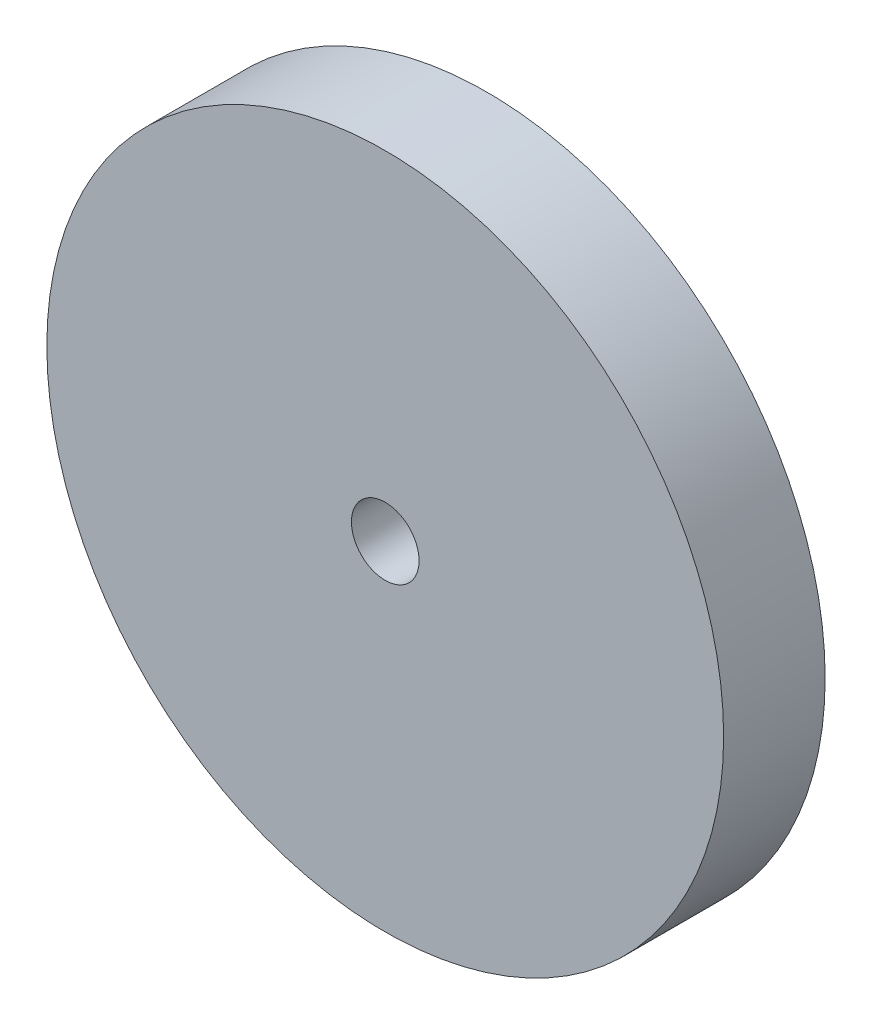
ISO-10303-21;
HEADER;
FILE_DESCRIPTION(('STEP AP214'),'2;1');
FILE_NAME('part.step','',(''),(''),'','','');
FILE_SCHEMA(('AUTOMOTIVE_DESIGN { 1 0 10303 214 1 1 1 1 }'));
ENDSEC;
DATA;
#1=APPLICATION_CONTEXT('core data for automotive mechanical design processes');
#2=APPLICATION_PROTOCOL_DEFINITION('international standard','automotive_design',2000,#1);
#3=PRODUCT_CONTEXT('',#1,'mechanical');
#4=PRODUCT('Part','Part','',(#3));
#5=PRODUCT_RELATED_PRODUCT_CATEGORY('part','',(#4));
#6=PRODUCT_DEFINITION_FORMATION('','',#4);
#7=PRODUCT_DEFINITION_CONTEXT('part definition',#1,'design');
#8=PRODUCT_DEFINITION('design','',#6,#7);
#9=PRODUCT_DEFINITION_SHAPE('','',#8);
#10=(LENGTH_UNIT() NAMED_UNIT(*) SI_UNIT(.MILLI.,.METRE.));
#11=(NAMED_UNIT(*) PLANE_ANGLE_UNIT() SI_UNIT($,.RADIAN.));
#12=(NAMED_UNIT(*) SI_UNIT($,.STERADIAN.) SOLID_ANGLE_UNIT());
#13=UNCERTAINTY_MEASURE_WITH_UNIT(LENGTH_MEASURE(1.E-05),#10,'distance_accuracy_value','');
#14=(GEOMETRIC_REPRESENTATION_CONTEXT(3) GLOBAL_UNCERTAINTY_ASSIGNED_CONTEXT((#13)) GLOBAL_UNIT_ASSIGNED_CONTEXT((#10,
#11,#12)) REPRESENTATION_CONTEXT('',''));
#15=CARTESIAN_POINT('',(0.,0.,0.));
#16=DIRECTION('',(0.,0.,1.));
#17=DIRECTION('',(1.,0.,0.));
#18=AXIS2_PLACEMENT_3D('',#15,#16,#17);
#19=CARTESIAN_POINT('',(0.,0.,30.));
#20=DIRECTION('',(0.,0.,1.));
#21=DIRECTION('',(1.,0.,0.));
#22=AXIS2_PLACEMENT_3D('',#19,#20,#21);
#23=PLANE('',#22);
#24=CARTESIAN_POINT('',(0.,0.,30.));
#25=DIRECTION('',(0.,0.,1.));
#26=DIRECTION('',(1.,0.,0.));
#27=AXIS2_PLACEMENT_3D('',#24,#25,#26);
#28=CIRCLE('',#27,100.);
#29=CARTESIAN_POINT('',(100.,0.,30.));
#30=VERTEX_POINT('',#29);
#31=EDGE_CURVE('E10',#30,#30,#28,.T.);
#32=ORIENTED_EDGE('',*,*,#31,.T.);
#33=EDGE_LOOP('',(#32));
#34=FACE_BOUND('',#33,.T.);
#35=CARTESIAN_POINT('',(0.,0.,30.));
#36=DIRECTION('',(0.,0.,1.));
#37=DIRECTION('',(1.,0.,0.));
#38=AXIS2_PLACEMENT_3D('',#35,#36,#37);
#39=CIRCLE('',#38,10.);
#40=CARTESIAN_POINT('',(10.,0.,30.));
#41=VERTEX_POINT('',#40);
#42=EDGE_CURVE('E50',#41,#41,#39,.T.);
#43=ORIENTED_EDGE('',*,*,#42,.F.);
#44=EDGE_LOOP('',(#43));
#45=FACE_BOUND('',#44,.T.);
#46=ADVANCED_FACE('F37',(#34,#45),#23,.T.);
#47=CARTESIAN_POINT('',(0.,0.,0.));
#48=DIRECTION('',(0.,0.,1.));
#49=DIRECTION('',(1.,0.,0.));
#50=AXIS2_PLACEMENT_3D('',#47,#48,#49);
#51=PLANE('',#50);
#52=CARTESIAN_POINT('',(0.,0.,0.));
#53=DIRECTION('',(0.,0.,1.));
#54=DIRECTION('',(1.,0.,0.));
#55=AXIS2_PLACEMENT_3D('',#52,#53,#54);
#56=CIRCLE('',#55,100.);
#57=CARTESIAN_POINT('',(100.,0.,0.));
#58=VERTEX_POINT('',#57);
#59=EDGE_CURVE('E41',#58,#58,#56,.T.);
#60=ORIENTED_EDGE('',*,*,#59,.F.);
#61=EDGE_LOOP('',(#60));
#62=FACE_BOUND('',#61,.T.);
#63=CARTESIAN_POINT('',(0.,0.,0.));
#64=DIRECTION('',(0.,0.,1.));
#65=DIRECTION('',(1.,0.,0.));
#66=AXIS2_PLACEMENT_3D('',#63,#64,#65);
#67=CIRCLE('',#66,10.);
#68=CARTESIAN_POINT('',(10.,0.,0.));
#69=VERTEX_POINT('',#68);
#70=EDGE_CURVE('E52',#69,#69,#67,.T.);
#71=ORIENTED_EDGE('',*,*,#70,.T.);
#72=EDGE_LOOP('',(#71));
#73=FACE_BOUND('',#72,.T.);
#74=ADVANCED_FACE('F64',(#62,#73),#51,.F.);
#75=CARTESIAN_POINT('',(0.,0.,30.));
#76=DIRECTION('',(0.,0.,-1.));
#77=DIRECTION('',(-1.,0.,0.));
#78=AXIS2_PLACEMENT_3D('',#75,#76,#77);
#79=CYLINDRICAL_SURFACE('',#78,100.);
#80=ORIENTED_EDGE('',*,*,#31,.F.);
#81=EDGE_LOOP('',(#80));
#82=FACE_BOUND('',#81,.T.);
#83=ORIENTED_EDGE('',*,*,#59,.T.);
#84=EDGE_LOOP('',(#83));
#85=FACE_BOUND('',#84,.T.);
#86=ADVANCED_FACE('F39',(#82,#85),#79,.T.);
#87=CARTESIAN_POINT('',(0.,0.,30.));
#88=DIRECTION('',(0.,0.,-1.));
#89=DIRECTION('',(-1.,0.,0.));
#90=AXIS2_PLACEMENT_3D('',#87,#88,#89);
#91=CYLINDRICAL_SURFACE('',#90,10.);
#92=ORIENTED_EDGE('',*,*,#42,.T.);
#93=EDGE_LOOP('',(#92));
#94=FACE_BOUND('',#93,.T.);
#95=ORIENTED_EDGE('',*,*,#70,.F.);
#96=EDGE_LOOP('',(#95));
#97=FACE_BOUND('',#96,.T.);
#98=ADVANCED_FACE('F60',(#94,#97),#91,.F.);
#99=CLOSED_SHELL('',(#46,#74,#86,#98));
#100=MANIFOLD_SOLID_BREP('B2',#99);
#101=ADVANCED_BREP_SHAPE_REPRESENTATION('',(#18,#100),#14);
#102=SHAPE_DEFINITION_REPRESENTATION(#9,#101);
ENDSEC;
END-ISO-10303-21;
